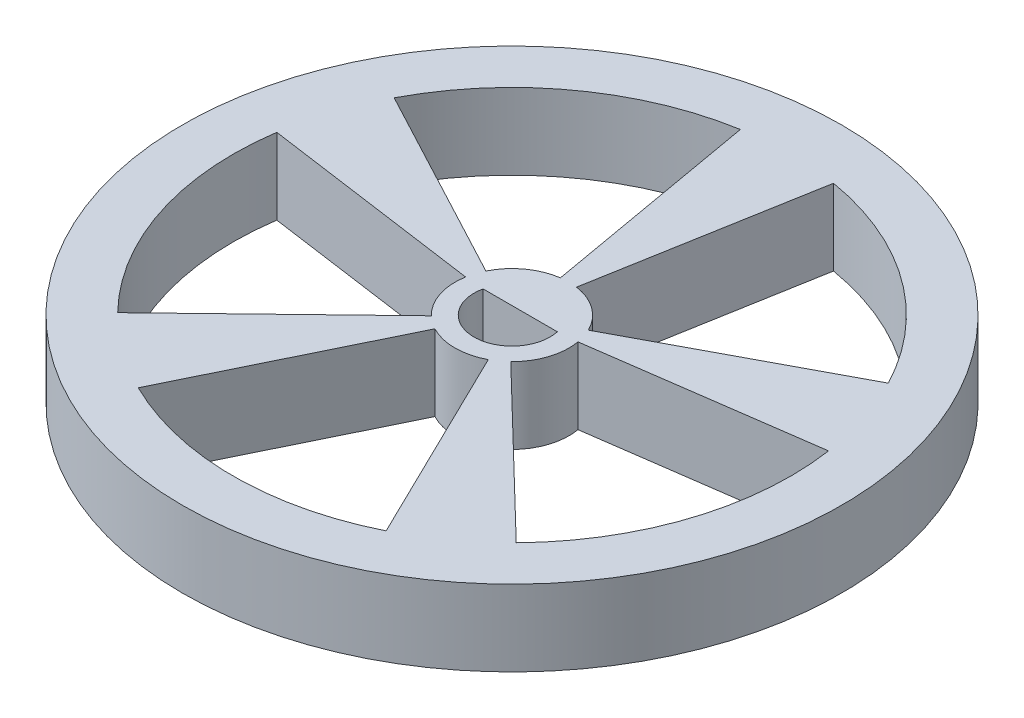
ISO-10303-21;
HEADER;
FILE_DESCRIPTION(('STEP AP214'),'2;1');
FILE_NAME('part.step','',(''),(''),'','','');
FILE_SCHEMA(('AUTOMOTIVE_DESIGN { 1 0 10303 214 1 1 1 1 }'));
ENDSEC;
DATA;
#1=APPLICATION_CONTEXT('core data for automotive mechanical design processes');
#2=APPLICATION_PROTOCOL_DEFINITION('international standard','automotive_design',2000,#1);
#3=PRODUCT_CONTEXT('',#1,'mechanical');
#4=PRODUCT('Part','Part','',(#3));
#5=PRODUCT_RELATED_PRODUCT_CATEGORY('part','',(#4));
#6=PRODUCT_DEFINITION_FORMATION('','',#4);
#7=PRODUCT_DEFINITION_CONTEXT('part definition',#1,'design');
#8=PRODUCT_DEFINITION('design','',#6,#7);
#9=PRODUCT_DEFINITION_SHAPE('','',#8);
#10=(LENGTH_UNIT() NAMED_UNIT(*) SI_UNIT(.MILLI.,.METRE.));
#11=(NAMED_UNIT(*) PLANE_ANGLE_UNIT() SI_UNIT($,.RADIAN.));
#12=(NAMED_UNIT(*) SI_UNIT($,.STERADIAN.) SOLID_ANGLE_UNIT());
#13=UNCERTAINTY_MEASURE_WITH_UNIT(LENGTH_MEASURE(1.E-05),#10,'distance_accuracy_value','');
#14=(GEOMETRIC_REPRESENTATION_CONTEXT(3) GLOBAL_UNCERTAINTY_ASSIGNED_CONTEXT((#13)) GLOBAL_UNIT_ASSIGNED_CONTEXT((#10,
#11,#12)) REPRESENTATION_CONTEXT('',''));
#15=CARTESIAN_POINT('',(0.,0.,0.));
#16=DIRECTION('',(0.,0.,1.));
#17=DIRECTION('',(1.,0.,0.));
#18=AXIS2_PLACEMENT_3D('',#15,#16,#17);
#19=CARTESIAN_POINT('',(0.,6.,0.));
#20=DIRECTION('',(0.,-1.,0.));
#21=DIRECTION('',(0.,0.,-1.));
#22=AXIS2_PLACEMENT_3D('',#19,#20,#21);
#23=CYLINDRICAL_SURFACE('',#22,3.);
#24=CARTESIAN_POINT('',(0.,0.6,0.));
#25=DIRECTION('',(0.,1.,0.));
#26=DIRECTION('',(0.,0.,1.));
#27=AXIS2_PLACEMENT_3D('',#24,#25,#26);
#28=CIRCLE('',#27,3.);
#29=CARTESIAN_POINT('',(-2.9287369291215,0.6,-0.65));
#30=VERTEX_POINT('',#29);
#31=CARTESIAN_POINT('',(2.92873692912149,0.6,-0.65));
#32=VERTEX_POINT('',#31);
#33=EDGE_CURVE('E52',#30,#32,#28,.T.);
#34=ORIENTED_EDGE('',*,*,#33,.F.);
#35=DIRECTION('',(0.,-1.,0.));
#36=VECTOR('',#35,1.);
#37=CARTESIAN_POINT('',(-2.92873692912149,6.,-0.65));
#38=LINE('',#37,#36);
#39=CARTESIAN_POINT('',(-2.92873692912149,6.,-0.65));
#40=VERTEX_POINT('',#39);
#41=EDGE_CURVE('E50',#40,#30,#38,.T.);
#42=ORIENTED_EDGE('',*,*,#41,.F.);
#43=CARTESIAN_POINT('',(0.,6.,0.));
#44=DIRECTION('',(0.,1.,0.));
#45=DIRECTION('',(0.,0.,1.));
#46=AXIS2_PLACEMENT_3D('',#43,#44,#45);
#47=CIRCLE('',#46,3.);
#48=CARTESIAN_POINT('',(2.92873692912149,6.,-0.65));
#49=VERTEX_POINT('',#48);
#50=EDGE_CURVE('E206',#40,#49,#47,.T.);
#51=ORIENTED_EDGE('',*,*,#50,.T.);
#52=DIRECTION('',(0.,-1.,0.));
#53=VECTOR('',#52,1.);
#54=CARTESIAN_POINT('',(2.92873692912149,6.,-0.65));
#55=LINE('',#54,#53);
#56=EDGE_CURVE('E328',#49,#32,#55,.T.);
#57=ORIENTED_EDGE('',*,*,#56,.T.);
#58=EDGE_LOOP('',(#34,#42,#51,#57));
#59=FACE_BOUND('',#58,.T.);
#60=ADVANCED_FACE('F39',(#59),#23,.F.);
#61=CARTESIAN_POINT('',(0.,6.,0.));
#62=DIRECTION('',(0.,-1.,0.));
#63=DIRECTION('',(0.,0.,-1.));
#64=AXIS2_PLACEMENT_3D('',#61,#62,#63);
#65=CYLINDRICAL_SURFACE('',#64,4.5);
#66=CARTESIAN_POINT('',(0.,0.,0.));
#67=DIRECTION('',(0.,1.,0.));
#68=DIRECTION('',(0.,0.,1.));
#69=AXIS2_PLACEMENT_3D('',#66,#67,#68);
#70=CIRCLE('',#69,4.5);
#71=CARTESIAN_POINT('',(-4.43315588635144,0.,-0.772741151554976));
#72=VERTEX_POINT('',#71);
#73=CARTESIAN_POINT('',(-3.13229259804772,0.,3.23090437497215));
#74=VERTEX_POINT('',#73);
#75=EDGE_CURVE('E288',#72,#74,#70,.T.);
#76=ORIENTED_EDGE('',*,*,#75,.T.);
#77=DIRECTION('',(0.,-1.,0.));
#78=VECTOR('',#77,1.);
#79=CARTESIAN_POINT('',(-3.13229259804772,6.,3.23090437497215));
#80=LINE('',#79,#78);
#81=CARTESIAN_POINT('',(-3.13229259804772,6.,3.23090437497215));
#82=VERTEX_POINT('',#81);
#83=EDGE_CURVE('E220',#82,#74,#80,.T.);
#84=ORIENTED_EDGE('',*,*,#83,.F.);
#85=CARTESIAN_POINT('',(0.,6.,0.));
#86=DIRECTION('',(0.,1.,0.));
#87=DIRECTION('',(0.,0.,1.));
#88=AXIS2_PLACEMENT_3D('',#85,#86,#87);
#89=CIRCLE('',#88,4.5);
#90=CARTESIAN_POINT('',(-4.43315588635144,6.,-0.772741151554976));
#91=VERTEX_POINT('',#90);
#92=EDGE_CURVE('E205',#91,#82,#89,.T.);
#93=ORIENTED_EDGE('',*,*,#92,.F.);
#94=DIRECTION('',(0.,-1.,0.));
#95=VECTOR('',#94,1.);
#96=CARTESIAN_POINT('',(-4.43315588635144,6.,-0.772741151554976));
#97=LINE('',#96,#95);
#98=EDGE_CURVE('E208',#91,#72,#97,.T.);
#99=ORIENTED_EDGE('',*,*,#98,.T.);
#100=EDGE_LOOP('',(#76,#84,#93,#99));
#101=FACE_BOUND('',#100,.T.);
#102=ADVANCED_FACE('F216',(#101),#65,.T.);
#103=CARTESIAN_POINT('',(0.102979516236048,6.,0.106638410761914));
#104=DIRECTION('',(-0.694658370459002,0.,-0.719339800338646));
#105=DIRECTION('',(-0.719339800338646,0.,0.694658370459003));
#106=AXIS2_PLACEMENT_3D('',#103,#104,#105);
#107=PLANE('',#106);
#108=DIRECTION('',(0.719339800338646,0.,-0.694658370459003));
#109=VECTOR('',#108,1.);
#110=CARTESIAN_POINT('',(0.102979516236048,0.,0.106638410761914));
#111=LINE('',#110,#109);
#112=CARTESIAN_POINT('',(-15.7221368009147,0.,15.3887755982509));
#113=VERTEX_POINT('',#112);
#114=EDGE_CURVE('E325',#113,#74,#111,.T.);
#115=ORIENTED_EDGE('',*,*,#114,.F.);
#116=DIRECTION('',(0.,-1.,0.));
#117=VECTOR('',#116,1.);
#118=CARTESIAN_POINT('',(-15.7221368009147,6.,15.3887755982509));
#119=LINE('',#118,#117);
#120=CARTESIAN_POINT('',(-15.7221368009147,6.,15.3887755982509));
#121=VERTEX_POINT('',#120);
#122=EDGE_CURVE('E333',#121,#113,#119,.T.);
#123=ORIENTED_EDGE('',*,*,#122,.F.);
#124=DIRECTION('',(0.719339800338646,0.,-0.694658370459003));
#125=VECTOR('',#124,1.);
#126=CARTESIAN_POINT('',(0.102979516236048,6.,0.106638410761914));
#127=LINE('',#126,#125);
#128=EDGE_CURVE('E218',#121,#82,#127,.T.);
#129=ORIENTED_EDGE('',*,*,#128,.T.);
#130=ORIENTED_EDGE('',*,*,#83,.T.);
#131=EDGE_LOOP('',(#115,#123,#129,#130));
#132=FACE_BOUND('',#131,.T.);
#133=ADVANCED_FACE('F399',(#132),#107,.T.);
#134=CARTESIAN_POINT('',(0.,6.,0.));
#135=DIRECTION('',(0.,-1.,0.));
#136=DIRECTION('',(0.,0.,-1.));
#137=AXIS2_PLACEMENT_3D('',#134,#135,#136);
#138=CYLINDRICAL_SURFACE('',#137,22.);
#139=CARTESIAN_POINT('',(0.,0.,0.));
#140=DIRECTION('',(0.,1.,0.));
#141=DIRECTION('',(0.,0.,1.));
#142=AXIS2_PLACEMENT_3D('',#139,#140,#141);
#143=CIRCLE('',#142,22.);
#144=CARTESIAN_POINT('',(-21.764771207318,0.,-3.20854083550449));
#145=VERTEX_POINT('',#144);
#146=EDGE_CURVE('E324',#145,#113,#143,.T.);
#147=ORIENTED_EDGE('',*,*,#146,.F.);
#148=DIRECTION('',(0.,-1.,0.));
#149=VECTOR('',#148,1.);
#150=CARTESIAN_POINT('',(-21.764771207318,6.,-3.20854083550449));
#151=LINE('',#150,#149);
#152=CARTESIAN_POINT('',(-21.764771207318,6.,-3.20854083550449));
#153=VERTEX_POINT('',#152);
#154=EDGE_CURVE('E213',#153,#145,#151,.T.);
#155=ORIENTED_EDGE('',*,*,#154,.F.);
#156=CARTESIAN_POINT('',(0.,6.,0.));
#157=DIRECTION('',(0.,1.,0.));
#158=DIRECTION('',(0.,0.,1.));
#159=AXIS2_PLACEMENT_3D('',#156,#157,#158);
#160=CIRCLE('',#159,22.);
#161=EDGE_CURVE('E202',#153,#121,#160,.T.);
#162=ORIENTED_EDGE('',*,*,#161,.T.);
#163=ORIENTED_EDGE('',*,*,#122,.T.);
#164=EDGE_LOOP('',(#147,#155,#162,#163));
#165=FACE_BOUND('',#164,.T.);
#166=ADVANCED_FACE('F415',(#165),#138,.F.);
#167=CARTESIAN_POINT('',(0.145992663880868,6.,-0.0257424456276981));
#168=DIRECTION('',(0.984807753012209,0.,-0.173648177666924));
#169=DIRECTION('',(-0.173648177666924,0.,-0.984807753012209));
#170=AXIS2_PLACEMENT_3D('',#167,#168,#169);
#171=PLANE('',#170);
#172=DIRECTION('',(0.173648177666924,0.,0.984807753012209));
#173=VECTOR('',#172,1.);
#174=CARTESIAN_POINT('',(0.145992663880868,0.,-0.0257424456276981));
#175=LINE('',#174,#173);
#176=CARTESIAN_POINT('',(-3.674180512338,0.,-21.6910211277099));
#177=VERTEX_POINT('',#176);
#178=CARTESIAN_POINT('',(-0.635000000000001,0.,-4.45497194155025));
#179=VERTEX_POINT('',#178);
#180=EDGE_CURVE('E315',#177,#179,#175,.T.);
#181=ORIENTED_EDGE('',*,*,#180,.T.);
#182=DIRECTION('',(0.,-1.,0.));
#183=VECTOR('',#182,1.);
#184=CARTESIAN_POINT('',(-0.635000000000001,6.,-4.45497194155025));
#185=LINE('',#184,#183);
#186=CARTESIAN_POINT('',(-0.635000000000001,6.,-4.45497194155025));
#187=VERTEX_POINT('',#186);
#188=EDGE_CURVE('E212',#187,#179,#185,.T.);
#189=ORIENTED_EDGE('',*,*,#188,.F.);
#190=DIRECTION('',(0.173648177666924,0.,0.984807753012209));
#191=VECTOR('',#190,1.);
#192=CARTESIAN_POINT('',(0.145992663880868,6.,-0.0257424456276981));
#193=LINE('',#192,#191);
#194=CARTESIAN_POINT('',(-3.674180512338,6.,-21.6910211277099));
#195=VERTEX_POINT('',#194);
#196=EDGE_CURVE('E228',#195,#187,#193,.T.);
#197=ORIENTED_EDGE('',*,*,#196,.F.);
#198=DIRECTION('',(0.,-1.,0.));
#199=VECTOR('',#198,1.);
#200=CARTESIAN_POINT('',(-3.674180512338,6.,-21.6910211277099));
#201=LINE('',#200,#199);
#202=EDGE_CURVE('E339',#195,#177,#201,.T.);
#203=ORIENTED_EDGE('',*,*,#202,.T.);
#204=EDGE_LOOP('',(#181,#189,#197,#203));
#205=FACE_BOUND('',#204,.T.);
#206=ADVANCED_FACE('F414',(#205),#171,.F.);
#207=CARTESIAN_POINT('',(-4.04070430349526,0.,-1.98058292724986));
#208=VERTEX_POINT('',#207);
#209=EDGE_CURVE('E312',#179,#208,#70,.T.);
#210=ORIENTED_EDGE('',*,*,#209,.T.);
#211=DIRECTION('',(0.,-1.,0.));
#212=VECTOR('',#211,1.);
#213=CARTESIAN_POINT('',(-4.04070430349526,6.,-1.98058292724986));
#214=LINE('',#213,#212);
#215=CARTESIAN_POINT('',(-4.04070430349526,6.,-1.98058292724986));
#216=VERTEX_POINT('',#215);
#217=EDGE_CURVE('E341',#216,#208,#214,.T.);
#218=ORIENTED_EDGE('',*,*,#217,.F.);
#219=EDGE_CURVE('E225',#187,#216,#89,.T.);
#220=ORIENTED_EDGE('',*,*,#219,.F.);
#221=ORIENTED_EDGE('',*,*,#188,.T.);
#222=EDGE_LOOP('',(#210,#218,#220,#221));
#223=FACE_BOUND('',#222,.T.);
#224=ADVANCED_FACE('F397',(#223),#65,.T.);
#225=CARTESIAN_POINT('',(-0.0695967348528918,6.,0.130892421139527));
#226=DIRECTION('',(0.469471562785884,0.,-0.88294759285893));
#227=DIRECTION('',(-0.88294759285893,0.,-0.469471562785885));
#228=AXIS2_PLACEMENT_3D('',#225,#226,#227);
#229=PLANE('',#228);
#230=DIRECTION('',(0.88294759285893,0.,0.469471562785884));
#231=VECTOR('',#230,1.);
#232=CARTESIAN_POINT('',(-0.0695967348528918,0.,0.130892421139527));
#233=LINE('',#232,#231);
#234=CARTESIAN_POINT('',(-19.4940027698907,0.,-10.197247472112));
#235=VERTEX_POINT('',#234);
#236=EDGE_CURVE('E316',#235,#208,#233,.T.);
#237=ORIENTED_EDGE('',*,*,#236,.F.);
#238=DIRECTION('',(0.,-1.,0.));
#239=VECTOR('',#238,1.);
#240=CARTESIAN_POINT('',(-19.4940027698907,6.,-10.197247472112));
#241=LINE('',#240,#239);
#242=CARTESIAN_POINT('',(-19.4940027698907,6.,-10.197247472112));
#243=VERTEX_POINT('',#242);
#244=EDGE_CURVE('E338',#243,#235,#241,.T.);
#245=ORIENTED_EDGE('',*,*,#244,.F.);
#246=DIRECTION('',(0.88294759285893,0.,0.469471562785884));
#247=VECTOR('',#246,1.);
#248=CARTESIAN_POINT('',(-0.0695967348528918,6.,0.130892421139527));
#249=LINE('',#248,#247);
#250=EDGE_CURVE('E227',#243,#216,#249,.T.);
#251=ORIENTED_EDGE('',*,*,#250,.T.);
#252=ORIENTED_EDGE('',*,*,#217,.T.);
#253=EDGE_LOOP('',(#237,#245,#251,#252));
#254=FACE_BOUND('',#253,.T.);
#255=ADVANCED_FACE('F482',(#254),#229,.T.);
#256=CARTESIAN_POINT('',(-0.133241576031189,6.,-0.0649862587822882));
#257=DIRECTION('',(-0.898794046299164,0.,-0.438371146789083));
#258=DIRECTION('',(-0.438371146789083,0.,0.898794046299164));
#259=AXIS2_PLACEMENT_3D('',#256,#257,#258);
#260=PLANE('',#259);
#261=DIRECTION('',(0.438371146789083,0.,-0.898794046299164));
#262=VECTOR('',#261,1.);
#263=CARTESIAN_POINT('',(-0.133241576031189,0.,-0.0649862587822882));
#264=LINE('',#263,#262);
#265=CARTESIAN_POINT('',(-9.77718785114921,0.,19.7080338370762));
#266=VERTEX_POINT('',#265);
#267=CARTESIAN_POINT('',(-2.10484101519148,0.,3.97739164538356));
#268=VERTEX_POINT('',#267);
#269=EDGE_CURVE('E305',#266,#268,#264,.T.);
#270=ORIENTED_EDGE('',*,*,#269,.T.);
#271=DIRECTION('',(0.,-1.,0.));
#272=VECTOR('',#271,1.);
#273=CARTESIAN_POINT('',(-2.10484101519148,6.,3.97739164538356));
#274=LINE('',#273,#272);
#275=CARTESIAN_POINT('',(-2.10484101519148,6.,3.97739164538356));
#276=VERTEX_POINT('',#275);
#277=EDGE_CURVE('E343',#276,#268,#274,.T.);
#278=ORIENTED_EDGE('',*,*,#277,.F.);
#279=DIRECTION('',(0.438371146789083,0.,-0.898794046299164));
#280=VECTOR('',#279,1.);
#281=CARTESIAN_POINT('',(-0.133241576031189,6.,-0.0649862587822882));
#282=LINE('',#281,#280);
#283=CARTESIAN_POINT('',(-9.77718785114921,6.,19.7080338370762));
#284=VERTEX_POINT('',#283);
#285=EDGE_CURVE('E249',#284,#276,#282,.T.);
#286=ORIENTED_EDGE('',*,*,#285,.F.);
#287=DIRECTION('',(0.,-1.,0.));
#288=VECTOR('',#287,1.);
#289=CARTESIAN_POINT('',(-9.77718785114921,6.,19.7080338370762));
#290=LINE('',#289,#288);
#291=EDGE_CURVE('E350',#284,#266,#290,.T.);
#292=ORIENTED_EDGE('',*,*,#291,.T.);
#293=EDGE_LOOP('',(#270,#278,#286,#292));
#294=FACE_BOUND('',#293,.T.);
#295=ADVANCED_FACE('F481',(#294),#260,.F.);
#296=CARTESIAN_POINT('',(2.10484101519233,0.,3.9773916453832));
#297=VERTEX_POINT('',#296);
#298=EDGE_CURVE('E302',#268,#297,#70,.T.);
#299=ORIENTED_EDGE('',*,*,#298,.T.);
#300=DIRECTION('',(0.,-1.,0.));
#301=VECTOR('',#300,1.);
#302=CARTESIAN_POINT('',(2.10484101519233,6.,3.9773916453832));
#303=LINE('',#302,#301);
#304=CARTESIAN_POINT('',(2.10484101519233,6.,3.9773916453832));
#305=VERTEX_POINT('',#304);
#306=EDGE_CURVE('E355',#305,#297,#303,.T.);
#307=ORIENTED_EDGE('',*,*,#306,.F.);
#308=EDGE_CURVE('E233',#276,#305,#89,.T.);
#309=ORIENTED_EDGE('',*,*,#308,.F.);
#310=ORIENTED_EDGE('',*,*,#277,.T.);
#311=EDGE_LOOP('',(#299,#307,#309,#310));
#312=FACE_BOUND('',#311,.T.);
#313=ADVANCED_FACE('F400',(#312),#65,.T.);
#314=CARTESIAN_POINT('',(0.133241576032019,6.,-0.0649862587826928));
#315=DIRECTION('',(-0.898794046299164,0.,0.438371146789084));
#316=DIRECTION('',(0.438371146789084,0.,0.898794046299164));
#317=AXIS2_PLACEMENT_3D('',#314,#315,#316);
#318=PLANE('',#317);
#319=DIRECTION('',(-0.438371146789084,0.,-0.898794046299164));
#320=VECTOR('',#319,1.);
#321=CARTESIAN_POINT('',(0.133241576032019,0.,-0.0649862587826928));
#322=LINE('',#321,#320);
#323=CARTESIAN_POINT('',(9.77718785115004,0.,19.7080338370758));
#324=VERTEX_POINT('',#323);
#325=EDGE_CURVE('E308',#324,#297,#322,.T.);
#326=ORIENTED_EDGE('',*,*,#325,.F.);
#327=DIRECTION('',(0.,-1.,0.));
#328=VECTOR('',#327,1.);
#329=CARTESIAN_POINT('',(9.77718785115004,6.,19.7080338370758));
#330=LINE('',#329,#328);
#331=CARTESIAN_POINT('',(9.77718785115004,6.,19.7080338370758));
#332=VERTEX_POINT('',#331);
#333=EDGE_CURVE('E349',#332,#324,#330,.T.);
#334=ORIENTED_EDGE('',*,*,#333,.F.);
#335=DIRECTION('',(-0.438371146789084,0.,-0.898794046299164));
#336=VECTOR('',#335,1.);
#337=CARTESIAN_POINT('',(0.133241576032019,6.,-0.0649862587826928));
#338=LINE('',#337,#336);
#339=EDGE_CURVE('E251',#332,#305,#338,.T.);
#340=ORIENTED_EDGE('',*,*,#339,.T.);
#341=ORIENTED_EDGE('',*,*,#306,.T.);
#342=EDGE_LOOP('',(#326,#334,#340,#341));
#343=FACE_BOUND('',#342,.T.);
#344=ADVANCED_FACE('F475',(#343),#318,.T.);
#345=CARTESIAN_POINT('',(0.,6.,0.));
#346=DIRECTION('',(0.,-1.,0.));
#347=DIRECTION('',(0.,0.,-1.));
#348=AXIS2_PLACEMENT_3D('',#345,#346,#347);
#349=CYLINDRICAL_SURFACE('',#348,22.);
#350=CARTESIAN_POINT('',(0.,0.,0.));
#351=DIRECTION('',(0.,1.,0.));
#352=DIRECTION('',(0.,0.,1.));
#353=AXIS2_PLACEMENT_3D('',#350,#351,#352);
#354=CIRCLE('',#353,22.);
#355=CARTESIAN_POINT('',(19.4940027698905,0.,-10.1972474721123));
#356=VERTEX_POINT('',#355);
#357=CARTESIAN_POINT('',(3.674180512338,0.,-21.6910211277099));
#358=VERTEX_POINT('',#357);
#359=EDGE_CURVE('E291',#356,#358,#354,.T.);
#360=ORIENTED_EDGE('',*,*,#359,.F.);
#361=DIRECTION('',(0.,-1.,0.));
#362=VECTOR('',#361,1.);
#363=CARTESIAN_POINT('',(19.4940027698905,6.,-10.1972474721123));
#364=LINE('',#363,#362);
#365=CARTESIAN_POINT('',(19.4940027698905,6.,-10.1972474721123));
#366=VERTEX_POINT('',#365);
#367=EDGE_CURVE('E348',#366,#356,#364,.T.);
#368=ORIENTED_EDGE('',*,*,#367,.F.);
#369=CARTESIAN_POINT('',(0.,6.,0.));
#370=DIRECTION('',(0.,1.,0.));
#371=DIRECTION('',(0.,0.,1.));
#372=AXIS2_PLACEMENT_3D('',#369,#370,#371);
#373=CIRCLE('',#372,22.);
#374=CARTESIAN_POINT('',(3.674180512338,6.,-21.6910211277099));
#375=VERTEX_POINT('',#374);
#376=EDGE_CURVE('E253',#366,#375,#373,.T.);
#377=ORIENTED_EDGE('',*,*,#376,.T.);
#378=DIRECTION('',(0.,-1.,0.));
#379=VECTOR('',#378,1.);
#380=CARTESIAN_POINT('',(3.674180512338,6.,-21.6910211277099));
#381=LINE('',#380,#379);
#382=EDGE_CURVE('E358',#375,#358,#381,.T.);
#383=ORIENTED_EDGE('',*,*,#382,.T.);
#384=EDGE_LOOP('',(#360,#368,#377,#383));
#385=FACE_BOUND('',#384,.T.);
#386=ADVANCED_FACE('F473',(#385),#349,.F.);
#387=CARTESIAN_POINT('',(0.0695967348527722,6.,0.130892421139302));
#388=DIRECTION('',(0.469471562785885,0.,0.88294759285893));
#389=DIRECTION('',(0.88294759285893,0.,-0.469471562785885));
#390=AXIS2_PLACEMENT_3D('',#387,#388,#389);
#391=PLANE('',#390);
#392=DIRECTION('',(-0.88294759285893,0.,0.469471562785885));
#393=VECTOR('',#392,1.);
#394=CARTESIAN_POINT('',(0.0695967348527722,0.,0.130892421139302));
#395=LINE('',#394,#393);
#396=CARTESIAN_POINT('',(4.04070430349537,0.,-1.98058292725022));
#397=VERTEX_POINT('',#396);
#398=EDGE_CURVE('E297',#356,#397,#395,.T.);
#399=ORIENTED_EDGE('',*,*,#398,.T.);
#400=DIRECTION('',(0.,-1.,0.));
#401=VECTOR('',#400,1.);
#402=CARTESIAN_POINT('',(4.04070430349537,6.,-1.98058292725022));
#403=LINE('',#402,#401);
#404=CARTESIAN_POINT('',(4.04070430349537,6.,-1.98058292725022));
#405=VERTEX_POINT('',#404);
#406=EDGE_CURVE('E357',#405,#397,#403,.T.);
#407=ORIENTED_EDGE('',*,*,#406,.F.);
#408=DIRECTION('',(-0.88294759285893,0.,0.469471562785885));
#409=VECTOR('',#408,1.);
#410=CARTESIAN_POINT('',(0.0695967348527722,6.,0.130892421139302));
#411=LINE('',#410,#409);
#412=EDGE_CURVE('E244',#366,#405,#411,.T.);
#413=ORIENTED_EDGE('',*,*,#412,.F.);
#414=ORIENTED_EDGE('',*,*,#367,.T.);
#415=EDGE_LOOP('',(#399,#407,#413,#414));
#416=FACE_BOUND('',#415,.T.);
#417=ADVANCED_FACE('F393',(#416),#391,.F.);
#418=CARTESIAN_POINT('',(0.635,0.,-4.45497194155025));
#419=VERTEX_POINT('',#418);
#420=EDGE_CURVE('E290',#397,#419,#70,.T.);
#421=ORIENTED_EDGE('',*,*,#420,.T.);
#422=DIRECTION('',(0.,-1.,0.));
#423=VECTOR('',#422,1.);
#424=CARTESIAN_POINT('',(0.635,6.,-4.45497194155025));
#425=LINE('',#424,#423);
#426=CARTESIAN_POINT('',(0.635,6.,-4.45497194155025));
#427=VERTEX_POINT('',#426);
#428=EDGE_CURVE('E356',#427,#419,#425,.T.);
#429=ORIENTED_EDGE('',*,*,#428,.F.);
#430=EDGE_CURVE('E234',#405,#427,#89,.T.);
#431=ORIENTED_EDGE('',*,*,#430,.F.);
#432=ORIENTED_EDGE('',*,*,#406,.T.);
#433=EDGE_LOOP('',(#421,#429,#431,#432));
#434=FACE_BOUND('',#433,.T.);
#435=ADVANCED_FACE('F384',(#434),#65,.T.);
#436=CARTESIAN_POINT('',(0.,6.,0.));
#437=DIRECTION('',(0.,-1.,0.));
#438=DIRECTION('',(0.,0.,-1.));
#439=AXIS2_PLACEMENT_3D('',#436,#437,#438);
#440=CYLINDRICAL_SURFACE('',#439,22.);
#441=CARTESIAN_POINT('',(0.,0.,0.));
#442=DIRECTION('',(0.,1.,0.));
#443=DIRECTION('',(0.,0.,1.));
#444=AXIS2_PLACEMENT_3D('',#441,#442,#443);
#445=CIRCLE('',#444,22.);
#446=CARTESIAN_POINT('',(15.7221368009153,0.,15.3887755982503));
#447=VERTEX_POINT('',#446);
#448=CARTESIAN_POINT('',(21.764771207318,0.,-3.20854083550491));
#449=VERTEX_POINT('',#448);
#450=EDGE_CURVE('E280',#447,#449,#445,.T.);
#451=ORIENTED_EDGE('',*,*,#450,.F.);
#452=DIRECTION('',(0.,-1.,0.));
#453=VECTOR('',#452,1.);
#454=CARTESIAN_POINT('',(15.7221368009153,6.,15.3887755982503));
#455=LINE('',#454,#453);
#456=CARTESIAN_POINT('',(15.7221368009153,6.,15.3887755982503));
#457=VERTEX_POINT('',#456);
#458=EDGE_CURVE('E136',#457,#447,#455,.T.);
#459=ORIENTED_EDGE('',*,*,#458,.F.);
#460=CARTESIAN_POINT('',(0.,6.,0.));
#461=DIRECTION('',(0.,1.,0.));
#462=DIRECTION('',(0.,0.,1.));
#463=AXIS2_PLACEMENT_3D('',#460,#461,#462);
#464=CIRCLE('',#463,22.);
#465=CARTESIAN_POINT('',(21.764771207318,6.,-3.20854083550491));
#466=VERTEX_POINT('',#465);
#467=EDGE_CURVE('E242',#457,#466,#464,.T.);
#468=ORIENTED_EDGE('',*,*,#467,.T.);
#469=DIRECTION('',(0.,-1.,0.));
#470=VECTOR('',#469,1.);
#471=CARTESIAN_POINT('',(21.764771207318,6.,-3.20854083550491));
#472=LINE('',#471,#470);
#473=EDGE_CURVE('E277',#466,#449,#472,.T.);
#474=ORIENTED_EDGE('',*,*,#473,.T.);
#475=EDGE_LOOP('',(#451,#459,#468,#474));
#476=FACE_BOUND('',#475,.T.);
#477=ADVANCED_FACE('F41',(#476),#440,.F.);
#478=CARTESIAN_POINT('',(-0.102979516235477,6.,0.106638410761324));
#479=DIRECTION('',(-0.694658370459002,0.,0.719339800338646));
#480=DIRECTION('',(0.719339800338647,0.,0.694658370459002));
#481=AXIS2_PLACEMENT_3D('',#478,#479,#480);
#482=PLANE('',#481);
#483=DIRECTION('',(-0.719339800338647,0.,-0.694658370459002));
#484=VECTOR('',#483,1.);
#485=CARTESIAN_POINT('',(-0.102979516235477,0.,0.106638410761324));
#486=LINE('',#485,#484);
#487=CARTESIAN_POINT('',(3.13229259804847,0.,3.23090437497172));
#488=VERTEX_POINT('',#487);
#489=EDGE_CURVE('E278',#447,#488,#486,.T.);
#490=ORIENTED_EDGE('',*,*,#489,.T.);
#491=DIRECTION('',(0.,-1.,0.));
#492=VECTOR('',#491,1.);
#493=CARTESIAN_POINT('',(3.13229259804847,6.,3.23090437497172));
#494=LINE('',#493,#492);
#495=CARTESIAN_POINT('',(3.13229259804847,6.,3.23090437497172));
#496=VERTEX_POINT('',#495);
#497=EDGE_CURVE('E370',#496,#488,#494,.T.);
#498=ORIENTED_EDGE('',*,*,#497,.F.);
#499=DIRECTION('',(-0.719339800338647,0.,-0.694658370459002));
#500=VECTOR('',#499,1.);
#501=CARTESIAN_POINT('',(-0.102979516235477,6.,0.106638410761324));
#502=LINE('',#501,#500);
#503=EDGE_CURVE('E231',#457,#496,#502,.T.);
#504=ORIENTED_EDGE('',*,*,#503,.F.);
#505=ORIENTED_EDGE('',*,*,#458,.T.);
#506=EDGE_LOOP('',(#490,#498,#504,#505));
#507=FACE_BOUND('',#506,.T.);
#508=ADVANCED_FACE('F371',(#507),#482,.F.);
#509=CARTESIAN_POINT('',(4.43315588635157,0.,-0.772741151555408));
#510=VERTEX_POINT('',#509);
#511=EDGE_CURVE('E285',#488,#510,#70,.T.);
#512=ORIENTED_EDGE('',*,*,#511,.T.);
#513=DIRECTION('',(0.,-1.,0.));
#514=VECTOR('',#513,1.);
#515=CARTESIAN_POINT('',(4.43315588635157,6.,-0.772741151555408));
#516=LINE('',#515,#514);
#517=CARTESIAN_POINT('',(4.43315588635157,6.,-0.772741151555408));
#518=VERTEX_POINT('',#517);
#519=EDGE_CURVE('E364',#518,#510,#516,.T.);
#520=ORIENTED_EDGE('',*,*,#519,.F.);
#521=EDGE_CURVE('E224',#496,#518,#89,.T.);
#522=ORIENTED_EDGE('',*,*,#521,.F.);
#523=ORIENTED_EDGE('',*,*,#497,.T.);
#524=EDGE_LOOP('',(#512,#520,#522,#523));
#525=FACE_BOUND('',#524,.T.);
#526=ADVANCED_FACE('F385',(#525),#65,.T.);
#527=CARTESIAN_POINT('',(0.0206316935336378,6.,-0.14680212749075));
#528=DIRECTION('',(0.139173100960072,0.,-0.990268068741569));
#529=DIRECTION('',(-0.99026806874157,0.,-0.139173100960072));
#530=AXIS2_PLACEMENT_3D('',#527,#528,#529);
#531=PLANE('',#530);
#532=DIRECTION('',(0.99026806874157,0.,0.139173100960072));
#533=VECTOR('',#532,1.);
#534=CARTESIAN_POINT('',(0.0206316935336378,0.,-0.14680212749075));
#535=LINE('',#534,#533);
#536=EDGE_CURVE('E128',#145,#72,#535,.T.);
#537=ORIENTED_EDGE('',*,*,#536,.T.);
#538=ORIENTED_EDGE('',*,*,#98,.F.);
#539=DIRECTION('',(0.99026806874157,0.,0.139173100960072));
#540=VECTOR('',#539,1.);
#541=CARTESIAN_POINT('',(0.0206316935336378,6.,-0.14680212749075));
#542=LINE('',#541,#540);
#543=EDGE_CURVE('E196',#153,#91,#542,.T.);
#544=ORIENTED_EDGE('',*,*,#543,.F.);
#545=ORIENTED_EDGE('',*,*,#154,.T.);
#546=EDGE_LOOP('',(#537,#538,#544,#545));
#547=FACE_BOUND('',#546,.T.);
#548=ADVANCED_FACE('F207',(#547),#531,.F.);
#549=CARTESIAN_POINT('',(0.,6.,0.));
#550=DIRECTION('',(0.,-1.,0.));
#551=DIRECTION('',(0.,0.,-1.));
#552=AXIS2_PLACEMENT_3D('',#549,#550,#551);
#553=CYLINDRICAL_SURFACE('',#552,22.);
#554=CARTESIAN_POINT('',(0.,0.,0.));
#555=DIRECTION('',(0.,1.,0.));
#556=DIRECTION('',(0.,0.,1.));
#557=AXIS2_PLACEMENT_3D('',#554,#555,#556);
#558=CIRCLE('',#557,22.);
#559=EDGE_CURVE('E317',#177,#235,#558,.T.);
#560=ORIENTED_EDGE('',*,*,#559,.F.);
#561=ORIENTED_EDGE('',*,*,#202,.F.);
#562=CARTESIAN_POINT('',(0.,6.,0.));
#563=DIRECTION('',(0.,1.,0.));
#564=DIRECTION('',(0.,0.,1.));
#565=AXIS2_PLACEMENT_3D('',#562,#563,#564);
#566=CIRCLE('',#565,22.);
#567=EDGE_CURVE('E219',#195,#243,#566,.T.);
#568=ORIENTED_EDGE('',*,*,#567,.T.);
#569=ORIENTED_EDGE('',*,*,#244,.T.);
#570=EDGE_LOOP('',(#560,#561,#568,#569));
#571=FACE_BOUND('',#570,.T.);
#572=ADVANCED_FACE('F388',(#571),#553,.F.);
#573=CARTESIAN_POINT('',(0.,6.,0.));
#574=DIRECTION('',(0.,-1.,0.));
#575=DIRECTION('',(0.,0.,-1.));
#576=AXIS2_PLACEMENT_3D('',#573,#574,#575);
#577=CYLINDRICAL_SURFACE('',#576,22.);
#578=CARTESIAN_POINT('',(0.,0.,0.));
#579=DIRECTION('',(0.,1.,0.));
#580=DIRECTION('',(0.,0.,1.));
#581=AXIS2_PLACEMENT_3D('',#578,#579,#580);
#582=CIRCLE('',#581,22.);
#583=EDGE_CURVE('E310',#266,#324,#582,.T.);
#584=ORIENTED_EDGE('',*,*,#583,.F.);
#585=ORIENTED_EDGE('',*,*,#291,.F.);
#586=CARTESIAN_POINT('',(0.,6.,0.));
#587=DIRECTION('',(0.,1.,0.));
#588=DIRECTION('',(0.,0.,1.));
#589=AXIS2_PLACEMENT_3D('',#586,#587,#588);
#590=CIRCLE('',#589,22.);
#591=EDGE_CURVE('E259',#284,#332,#590,.T.);
#592=ORIENTED_EDGE('',*,*,#591,.T.);
#593=ORIENTED_EDGE('',*,*,#333,.T.);
#594=EDGE_LOOP('',(#584,#585,#592,#593));
#595=FACE_BOUND('',#594,.T.);
#596=ADVANCED_FACE('F477',(#595),#577,.F.);
#597=CARTESIAN_POINT('',(-0.145992663880868,6.,-0.0257424456276982));
#598=DIRECTION('',(0.984807753012209,0.,0.173648177666924));
#599=DIRECTION('',(0.173648177666924,0.,-0.984807753012209));
#600=AXIS2_PLACEMENT_3D('',#597,#598,#599);
#601=PLANE('',#600);
#602=DIRECTION('',(-0.173648177666924,0.,0.984807753012209));
#603=VECTOR('',#602,1.);
#604=CARTESIAN_POINT('',(-0.145992663880868,0.,-0.0257424456276982));
#605=LINE('',#604,#603);
#606=EDGE_CURVE('E296',#358,#419,#605,.T.);
#607=ORIENTED_EDGE('',*,*,#606,.F.);
#608=ORIENTED_EDGE('',*,*,#382,.F.);
#609=DIRECTION('',(-0.173648177666924,0.,0.984807753012209));
#610=VECTOR('',#609,1.);
#611=CARTESIAN_POINT('',(-0.145992663880868,6.,-0.0257424456276982));
#612=LINE('',#611,#610);
#613=EDGE_CURVE('E245',#375,#427,#612,.T.);
#614=ORIENTED_EDGE('',*,*,#613,.T.);
#615=ORIENTED_EDGE('',*,*,#428,.T.);
#616=EDGE_LOOP('',(#607,#608,#614,#615));
#617=FACE_BOUND('',#616,.T.);
#618=ADVANCED_FACE('F436',(#617),#601,.T.);
#619=CARTESIAN_POINT('',(0.,6.,0.));
#620=DIRECTION('',(0.,-1.,0.));
#621=DIRECTION('',(0.,0.,-1.));
#622=AXIS2_PLACEMENT_3D('',#619,#620,#621);
#623=CYLINDRICAL_SURFACE('',#622,26.);
#624=CARTESIAN_POINT('',(0.,6.,0.));
#625=DIRECTION('',(0.,1.,0.));
#626=DIRECTION('',(0.,0.,1.));
#627=AXIS2_PLACEMENT_3D('',#624,#625,#626);
#628=CIRCLE('',#627,26.);
#629=CARTESIAN_POINT('',(0.,6.,26.));
#630=VERTEX_POINT('',#629);
#631=EDGE_CURVE('E238',#630,#630,#628,.T.);
#632=ORIENTED_EDGE('',*,*,#631,.F.);
#633=EDGE_LOOP('',(#632));
#634=FACE_BOUND('',#633,.T.);
#635=CARTESIAN_POINT('',(0.,0.,0.));
#636=DIRECTION('',(0.,1.,0.));
#637=DIRECTION('',(0.,0.,1.));
#638=AXIS2_PLACEMENT_3D('',#635,#636,#637);
#639=CIRCLE('',#638,26.);
#640=CARTESIAN_POINT('',(0.,0.,26.));
#641=VERTEX_POINT('',#640);
#642=EDGE_CURVE('E287',#641,#641,#639,.T.);
#643=ORIENTED_EDGE('',*,*,#642,.T.);
#644=EDGE_LOOP('',(#643));
#645=FACE_BOUND('',#644,.T.);
#646=ADVANCED_FACE('F450',(#634,#645),#623,.T.);
#647=CARTESIAN_POINT('',(-0.0206316935336955,6.,-0.14680212749116));
#648=DIRECTION('',(0.139173100960072,0.,0.990268068741569));
#649=DIRECTION('',(0.990268068741569,0.,-0.139173100960072));
#650=AXIS2_PLACEMENT_3D('',#647,#648,#649);
#651=PLANE('',#650);
#652=DIRECTION('',(-0.990268068741569,0.,0.139173100960072));
#653=VECTOR('',#652,1.);
#654=CARTESIAN_POINT('',(-0.0206316935336955,0.,-0.14680212749116));
#655=LINE('',#654,#653);
#656=EDGE_CURVE('E283',#449,#510,#655,.T.);
#657=ORIENTED_EDGE('',*,*,#656,.F.);
#658=ORIENTED_EDGE('',*,*,#473,.F.);
#659=DIRECTION('',(-0.990268068741569,0.,0.139173100960072));
#660=VECTOR('',#659,1.);
#661=CARTESIAN_POINT('',(-0.0206316935336955,6.,-0.14680212749116));
#662=LINE('',#661,#660);
#663=EDGE_CURVE('E235',#466,#518,#662,.T.);
#664=ORIENTED_EDGE('',*,*,#663,.T.);
#665=ORIENTED_EDGE('',*,*,#519,.T.);
#666=EDGE_LOOP('',(#657,#658,#664,#665));
#667=FACE_BOUND('',#666,.T.);
#668=ADVANCED_FACE('F379',(#667),#651,.T.);
#669=CARTESIAN_POINT('',(0.,6.,-0.65));
#670=DIRECTION('',(0.,0.,-1.));
#671=DIRECTION('',(-1.,0.,0.));
#672=AXIS2_PLACEMENT_3D('',#669,#670,#671);
#673=PLANE('',#672);
#674=ORIENTED_EDGE('',*,*,#41,.T.);
#675=DIRECTION('',(1.,0.,0.));
#676=VECTOR('',#675,1.);
#677=CARTESIAN_POINT('',(0.,0.6,-0.65));
#678=LINE('',#677,#676);
#679=EDGE_CURVE('E11',#30,#32,#678,.T.);
#680=ORIENTED_EDGE('',*,*,#679,.T.);
#681=ORIENTED_EDGE('',*,*,#56,.F.);
#682=DIRECTION('',(1.,0.,0.));
#683=VECTOR('',#682,1.);
#684=CARTESIAN_POINT('',(0.,6.,-0.65));
#685=LINE('',#684,#683);
#686=EDGE_CURVE('E58',#40,#49,#685,.T.);
#687=ORIENTED_EDGE('',*,*,#686,.F.);
#688=EDGE_LOOP('',(#674,#680,#681,#687));
#689=FACE_BOUND('',#688,.T.);
#690=ADVANCED_FACE('F406',(#689),#673,.F.);
#691=CARTESIAN_POINT('',(0.,6.,0.));
#692=DIRECTION('',(0.,1.,0.));
#693=DIRECTION('',(0.,0.,1.));
#694=AXIS2_PLACEMENT_3D('',#691,#692,#693);
#695=PLANE('',#694);
#696=ORIENTED_EDGE('',*,*,#467,.F.);
#697=ORIENTED_EDGE('',*,*,#503,.T.);
#698=ORIENTED_EDGE('',*,*,#521,.T.);
#699=ORIENTED_EDGE('',*,*,#663,.F.);
#700=EDGE_LOOP('',(#696,#697,#698,#699));
#701=FACE_BOUND('',#700,.T.);
#702=ORIENTED_EDGE('',*,*,#631,.T.);
#703=EDGE_LOOP('',(#702));
#704=FACE_BOUND('',#703,.T.);
#705=ORIENTED_EDGE('',*,*,#376,.F.);
#706=ORIENTED_EDGE('',*,*,#412,.T.);
#707=ORIENTED_EDGE('',*,*,#430,.T.);
#708=ORIENTED_EDGE('',*,*,#613,.F.);
#709=EDGE_LOOP('',(#705,#706,#707,#708));
#710=FACE_BOUND('',#709,.T.);
#711=ORIENTED_EDGE('',*,*,#285,.T.);
#712=ORIENTED_EDGE('',*,*,#308,.T.);
#713=ORIENTED_EDGE('',*,*,#339,.F.);
#714=ORIENTED_EDGE('',*,*,#591,.F.);
#715=EDGE_LOOP('',(#711,#712,#713,#714));
#716=FACE_BOUND('',#715,.T.);
#717=ORIENTED_EDGE('',*,*,#196,.T.);
#718=ORIENTED_EDGE('',*,*,#219,.T.);
#719=ORIENTED_EDGE('',*,*,#250,.F.);
#720=ORIENTED_EDGE('',*,*,#567,.F.);
#721=EDGE_LOOP('',(#717,#718,#719,#720));
#722=FACE_BOUND('',#721,.T.);
#723=ORIENTED_EDGE('',*,*,#92,.T.);
#724=ORIENTED_EDGE('',*,*,#128,.F.);
#725=ORIENTED_EDGE('',*,*,#161,.F.);
#726=ORIENTED_EDGE('',*,*,#543,.T.);
#727=EDGE_LOOP('',(#723,#724,#725,#726));
#728=FACE_BOUND('',#727,.T.);
#729=ORIENTED_EDGE('',*,*,#50,.F.);
#730=ORIENTED_EDGE('',*,*,#686,.T.);
#731=EDGE_LOOP('',(#729,#730));
#732=FACE_BOUND('',#731,.T.);
#733=ADVANCED_FACE('F200',(#701,#704,#710,#716,#722,#728,#732),#695,.T.);
#734=CARTESIAN_POINT('',(0.,0.,0.));
#735=DIRECTION('',(0.,1.,0.));
#736=DIRECTION('',(0.,0.,1.));
#737=AXIS2_PLACEMENT_3D('',#734,#735,#736);
#738=PLANE('',#737);
#739=ORIENTED_EDGE('',*,*,#450,.T.);
#740=ORIENTED_EDGE('',*,*,#656,.T.);
#741=ORIENTED_EDGE('',*,*,#511,.F.);
#742=ORIENTED_EDGE('',*,*,#489,.F.);
#743=EDGE_LOOP('',(#739,#740,#741,#742));
#744=FACE_BOUND('',#743,.T.);
#745=ORIENTED_EDGE('',*,*,#642,.F.);
#746=EDGE_LOOP('',(#745));
#747=FACE_BOUND('',#746,.T.);
#748=ORIENTED_EDGE('',*,*,#359,.T.);
#749=ORIENTED_EDGE('',*,*,#606,.T.);
#750=ORIENTED_EDGE('',*,*,#420,.F.);
#751=ORIENTED_EDGE('',*,*,#398,.F.);
#752=EDGE_LOOP('',(#748,#749,#750,#751));
#753=FACE_BOUND('',#752,.T.);
#754=ORIENTED_EDGE('',*,*,#269,.F.);
#755=ORIENTED_EDGE('',*,*,#583,.T.);
#756=ORIENTED_EDGE('',*,*,#325,.T.);
#757=ORIENTED_EDGE('',*,*,#298,.F.);
#758=EDGE_LOOP('',(#754,#755,#756,#757));
#759=FACE_BOUND('',#758,.T.);
#760=ORIENTED_EDGE('',*,*,#180,.F.);
#761=ORIENTED_EDGE('',*,*,#559,.T.);
#762=ORIENTED_EDGE('',*,*,#236,.T.);
#763=ORIENTED_EDGE('',*,*,#209,.F.);
#764=EDGE_LOOP('',(#760,#761,#762,#763));
#765=FACE_BOUND('',#764,.T.);
#766=ORIENTED_EDGE('',*,*,#75,.F.);
#767=ORIENTED_EDGE('',*,*,#536,.F.);
#768=ORIENTED_EDGE('',*,*,#146,.T.);
#769=ORIENTED_EDGE('',*,*,#114,.T.);
#770=EDGE_LOOP('',(#766,#767,#768,#769));
#771=FACE_BOUND('',#770,.T.);
#772=ADVANCED_FACE('F376',(#744,#747,#753,#759,#765,#771),#738,.F.);
#773=CARTESIAN_POINT('',(0.,0.6,0.));
#774=DIRECTION('',(0.,1.,0.));
#775=DIRECTION('',(0.,0.,1.));
#776=AXIS2_PLACEMENT_3D('',#773,#774,#775);
#777=PLANE('',#776);
#778=ORIENTED_EDGE('',*,*,#679,.F.);
#779=ORIENTED_EDGE('',*,*,#33,.T.);
#780=EDGE_LOOP('',(#778,#779));
#781=FACE_BOUND('',#780,.T.);
#782=ADVANCED_FACE('F451',(#781),#777,.T.);
#783=CLOSED_SHELL('',(#60,#102,#133,#166,#206,#224,#255,#295,#313,#344,#386,#417,#435,#477,#508,
#526,#548,#572,#596,#618,#646,#668,#690,#733,#772,#782));
#784=MANIFOLD_SOLID_BREP('B2',#783);
#785=ADVANCED_BREP_SHAPE_REPRESENTATION('',(#18,#784),#14);
#786=SHAPE_DEFINITION_REPRESENTATION(#9,#785);
ENDSEC;
END-ISO-10303-21;
